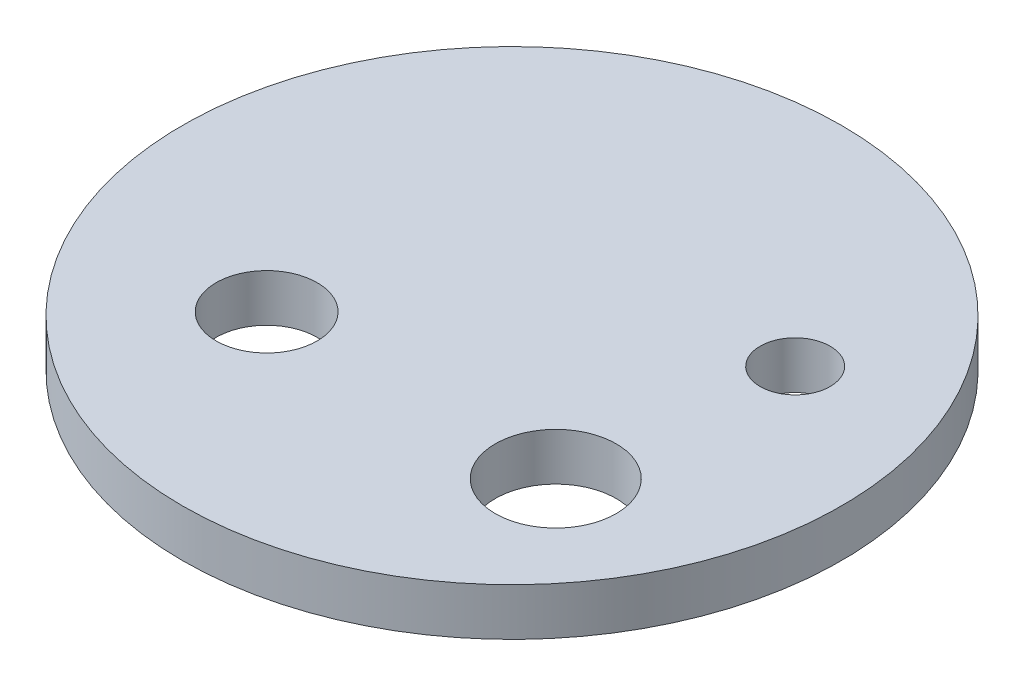
ISO-10303-21;
HEADER;
FILE_DESCRIPTION(('STEP AP214'),'2;1');
FILE_NAME('part.step','',(''),(''),'','','');
FILE_SCHEMA(('AUTOMOTIVE_DESIGN { 1 0 10303 214 1 1 1 1 }'));
ENDSEC;
DATA;
#1=APPLICATION_CONTEXT('core data for automotive mechanical design processes');
#2=APPLICATION_PROTOCOL_DEFINITION('international standard','automotive_design',2000,#1);
#3=PRODUCT_CONTEXT('',#1,'mechanical');
#4=PRODUCT('Part','Part','',(#3));
#5=PRODUCT_RELATED_PRODUCT_CATEGORY('part','',(#4));
#6=PRODUCT_DEFINITION_FORMATION('','',#4);
#7=PRODUCT_DEFINITION_CONTEXT('part definition',#1,'design');
#8=PRODUCT_DEFINITION('design','',#6,#7);
#9=PRODUCT_DEFINITION_SHAPE('','',#8);
#10=(LENGTH_UNIT() NAMED_UNIT(*) SI_UNIT(.MILLI.,.METRE.));
#11=(NAMED_UNIT(*) PLANE_ANGLE_UNIT() SI_UNIT($,.RADIAN.));
#12=(NAMED_UNIT(*) SI_UNIT($,.STERADIAN.) SOLID_ANGLE_UNIT());
#13=UNCERTAINTY_MEASURE_WITH_UNIT(LENGTH_MEASURE(1.E-05),#10,'distance_accuracy_value','');
#14=(GEOMETRIC_REPRESENTATION_CONTEXT(3) GLOBAL_UNCERTAINTY_ASSIGNED_CONTEXT((#13)) GLOBAL_UNIT_ASSIGNED_CONTEXT((#10,
#11,#12)) REPRESENTATION_CONTEXT('',''));
#15=CARTESIAN_POINT('',(0.,0.,0.));
#16=DIRECTION('',(0.,0.,1.));
#17=DIRECTION('',(1.,0.,0.));
#18=AXIS2_PLACEMENT_3D('',#15,#16,#17);
#19=CARTESIAN_POINT('',(0.,10.,0.));
#20=DIRECTION('',(0.,1.,0.));
#21=DIRECTION('',(0.,0.,1.));
#22=AXIS2_PLACEMENT_3D('',#19,#20,#21);
#23=PLANE('',#22);
#24=CARTESIAN_POINT('',(34.4038529693058,10.,25.1753516363375));
#25=DIRECTION('',(0.,1.,0.));
#26=DIRECTION('',(0.,0.,1.));
#27=AXIS2_PLACEMENT_3D('',#24,#25,#26);
#28=CIRCLE('',#27,12.7583688822444);
#29=CARTESIAN_POINT('',(34.4038529693058,10.,37.9337205185819));
#30=VERTEX_POINT('',#29);
#31=EDGE_CURVE('E51',#30,#30,#28,.T.);
#32=ORIENTED_EDGE('',*,*,#31,.F.);
#33=EDGE_LOOP('',(#32));
#34=FACE_BOUND('',#33,.T.);
#35=CARTESIAN_POINT('',(0.,10.,0.));
#36=DIRECTION('',(0.,1.,0.));
#37=DIRECTION('',(0.,0.,1.));
#38=AXIS2_PLACEMENT_3D('',#35,#36,#37);
#39=CIRCLE('',#38,69.5131005095295);
#40=CARTESIAN_POINT('',(0.,10.,69.5131005095295));
#41=VERTEX_POINT('',#40);
#42=EDGE_CURVE('E10',#41,#41,#39,.T.);
#43=ORIENTED_EDGE('',*,*,#42,.T.);
#44=EDGE_LOOP('',(#43));
#45=FACE_BOUND('',#44,.T.);
#46=CARTESIAN_POINT('',(39.1288456517856,10.,-20.5980149751852));
#47=DIRECTION('',(0.,1.,0.));
#48=DIRECTION('',(0.,0.,1.));
#49=AXIS2_PLACEMENT_3D('',#46,#47,#48);
#50=CIRCLE('',#49,7.38280106637464);
#51=CARTESIAN_POINT('',(39.1288456517856,10.,-13.2152139088106));
#52=VERTEX_POINT('',#51);
#53=EDGE_CURVE('E46',#52,#52,#50,.T.);
#54=ORIENTED_EDGE('',*,*,#53,.F.);
#55=EDGE_LOOP('',(#54));
#56=FACE_BOUND('',#55,.T.);
#57=CARTESIAN_POINT('',(-26.5780838389487,10.,25.1753516363375));
#58=DIRECTION('',(0.,1.,0.));
#59=DIRECTION('',(0.,0.,1.));
#60=AXIS2_PLACEMENT_3D('',#57,#58,#59);
#61=CIRCLE('',#60,10.6578603061084);
#62=CARTESIAN_POINT('',(-26.5780838389487,10.,35.8332119424459));
#63=VERTEX_POINT('',#62);
#64=EDGE_CURVE('E57',#63,#63,#61,.T.);
#65=ORIENTED_EDGE('',*,*,#64,.F.);
#66=EDGE_LOOP('',(#65));
#67=FACE_BOUND('',#66,.T.);
#68=ADVANCED_FACE('F35',(#34,#45,#56,#67),#23,.T.);
#69=CARTESIAN_POINT('',(0.,0.,0.));
#70=DIRECTION('',(0.,1.,0.));
#71=DIRECTION('',(0.,0.,1.));
#72=AXIS2_PLACEMENT_3D('',#69,#70,#71);
#73=PLANE('',#72);
#74=CARTESIAN_POINT('',(0.,0.,0.));
#75=DIRECTION('',(0.,1.,0.));
#76=DIRECTION('',(0.,0.,1.));
#77=AXIS2_PLACEMENT_3D('',#74,#75,#76);
#78=CIRCLE('',#77,69.5131005095295);
#79=CARTESIAN_POINT('',(0.,0.,69.5131005095295));
#80=VERTEX_POINT('',#79);
#81=EDGE_CURVE('E39',#80,#80,#78,.T.);
#82=ORIENTED_EDGE('',*,*,#81,.F.);
#83=EDGE_LOOP('',(#82));
#84=FACE_BOUND('',#83,.T.);
#85=CARTESIAN_POINT('',(39.1288456517856,0.,-20.5980149751852));
#86=DIRECTION('',(0.,1.,0.));
#87=DIRECTION('',(0.,0.,1.));
#88=AXIS2_PLACEMENT_3D('',#85,#86,#87);
#89=CIRCLE('',#88,7.38280106637464);
#90=CARTESIAN_POINT('',(39.1288456517856,0.,-13.2152139088106));
#91=VERTEX_POINT('',#90);
#92=EDGE_CURVE('E48',#91,#91,#89,.T.);
#93=ORIENTED_EDGE('',*,*,#92,.T.);
#94=EDGE_LOOP('',(#93));
#95=FACE_BOUND('',#94,.T.);
#96=CARTESIAN_POINT('',(34.4038529693058,0.,25.1753516363375));
#97=DIRECTION('',(0.,1.,0.));
#98=DIRECTION('',(0.,0.,1.));
#99=AXIS2_PLACEMENT_3D('',#96,#97,#98);
#100=CIRCLE('',#99,12.7583688822444);
#101=CARTESIAN_POINT('',(34.4038529693058,0.,37.9337205185819));
#102=VERTEX_POINT('',#101);
#103=EDGE_CURVE('E54',#102,#102,#100,.T.);
#104=ORIENTED_EDGE('',*,*,#103,.T.);
#105=EDGE_LOOP('',(#104));
#106=FACE_BOUND('',#105,.T.);
#107=CARTESIAN_POINT('',(-26.5780838389487,0.,25.1753516363375));
#108=DIRECTION('',(0.,1.,0.));
#109=DIRECTION('',(0.,0.,1.));
#110=AXIS2_PLACEMENT_3D('',#107,#108,#109);
#111=CIRCLE('',#110,10.6578603061084);
#112=CARTESIAN_POINT('',(-26.5780838389487,0.,35.8332119424459));
#113=VERTEX_POINT('',#112);
#114=EDGE_CURVE('E60',#113,#113,#111,.T.);
#115=ORIENTED_EDGE('',*,*,#114,.T.);
#116=EDGE_LOOP('',(#115));
#117=FACE_BOUND('',#116,.T.);
#118=ADVANCED_FACE('F70',(#84,#95,#106,#117),#73,.F.);
#119=CARTESIAN_POINT('',(0.,10.,0.));
#120=DIRECTION('',(0.,-1.,0.));
#121=DIRECTION('',(0.,0.,-1.));
#122=AXIS2_PLACEMENT_3D('',#119,#120,#121);
#123=CYLINDRICAL_SURFACE('',#122,69.5131005095295);
#124=ORIENTED_EDGE('',*,*,#42,.F.);
#125=EDGE_LOOP('',(#124));
#126=FACE_BOUND('',#125,.T.);
#127=ORIENTED_EDGE('',*,*,#81,.T.);
#128=EDGE_LOOP('',(#127));
#129=FACE_BOUND('',#128,.T.);
#130=ADVANCED_FACE('F37',(#126,#129),#123,.T.);
#131=CARTESIAN_POINT('',(39.1288456517856,10.,-20.5980149751852));
#132=DIRECTION('',(0.,-1.,0.));
#133=DIRECTION('',(0.,0.,-1.));
#134=AXIS2_PLACEMENT_3D('',#131,#132,#133);
#135=CYLINDRICAL_SURFACE('',#134,7.38280106637464);
#136=ORIENTED_EDGE('',*,*,#53,.T.);
#137=EDGE_LOOP('',(#136));
#138=FACE_BOUND('',#137,.T.);
#139=ORIENTED_EDGE('',*,*,#92,.F.);
#140=EDGE_LOOP('',(#139));
#141=FACE_BOUND('',#140,.T.);
#142=ADVANCED_FACE('F79',(#138,#141),#135,.F.);
#143=CARTESIAN_POINT('',(34.4038529693058,10.,25.1753516363375));
#144=DIRECTION('',(0.,-1.,0.));
#145=DIRECTION('',(0.,0.,-1.));
#146=AXIS2_PLACEMENT_3D('',#143,#144,#145);
#147=CYLINDRICAL_SURFACE('',#146,12.7583688822444);
#148=ORIENTED_EDGE('',*,*,#31,.T.);
#149=EDGE_LOOP('',(#148));
#150=FACE_BOUND('',#149,.T.);
#151=ORIENTED_EDGE('',*,*,#103,.F.);
#152=EDGE_LOOP('',(#151));
#153=FACE_BOUND('',#152,.T.);
#154=ADVANCED_FACE('F82',(#150,#153),#147,.F.);
#155=CARTESIAN_POINT('',(-26.5780838389487,10.,25.1753516363375));
#156=DIRECTION('',(0.,-1.,0.));
#157=DIRECTION('',(0.,0.,-1.));
#158=AXIS2_PLACEMENT_3D('',#155,#156,#157);
#159=CYLINDRICAL_SURFACE('',#158,10.6578603061084);
#160=ORIENTED_EDGE('',*,*,#64,.T.);
#161=EDGE_LOOP('',(#160));
#162=FACE_BOUND('',#161,.T.);
#163=ORIENTED_EDGE('',*,*,#114,.F.);
#164=EDGE_LOOP('',(#163));
#165=FACE_BOUND('',#164,.T.);
#166=ADVANCED_FACE('F66',(#162,#165),#159,.F.);
#167=CLOSED_SHELL('',(#68,#118,#130,#142,#154,#166));
#168=MANIFOLD_SOLID_BREP('B2',#167);
#169=ADVANCED_BREP_SHAPE_REPRESENTATION('',(#18,#168),#14);
#170=SHAPE_DEFINITION_REPRESENTATION(#9,#169);
ENDSEC;
END-ISO-10303-21;
